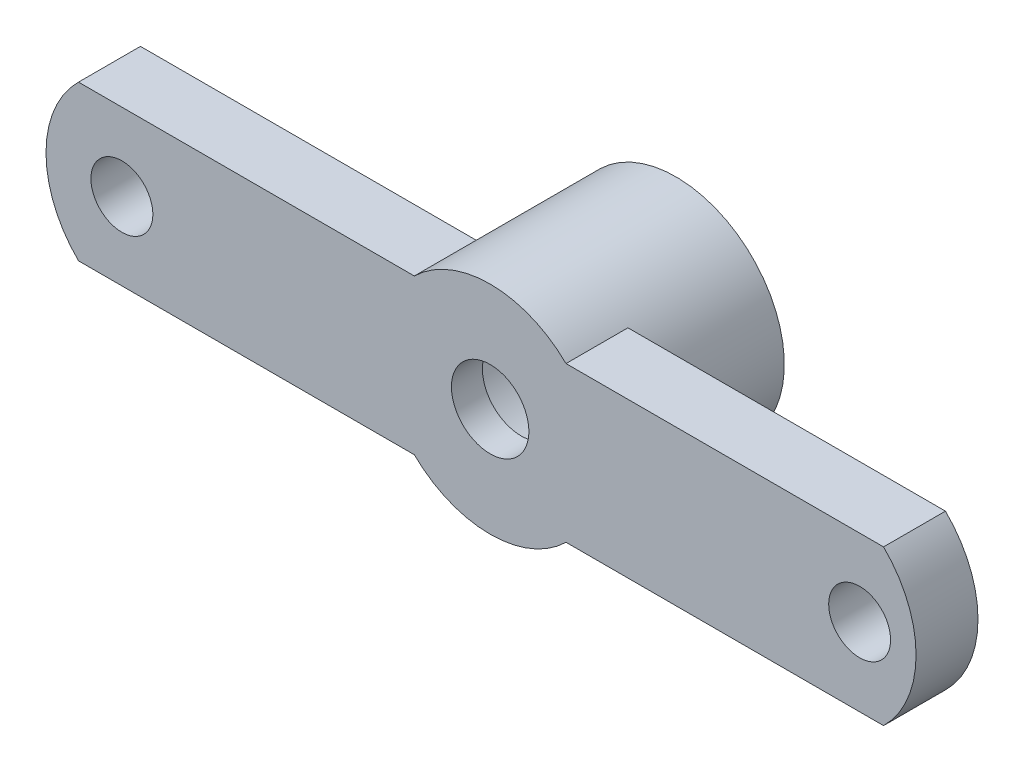
ISO-10303-21;
HEADER;
FILE_DESCRIPTION(('STEP AP214'),'2;1');
FILE_NAME('part.step','',(''),(''),'','','');
FILE_SCHEMA(('AUTOMOTIVE_DESIGN { 1 0 10303 214 1 1 1 1 }'));
ENDSEC;
DATA;
#1=APPLICATION_CONTEXT('core data for automotive mechanical design processes');
#2=APPLICATION_PROTOCOL_DEFINITION('international standard','automotive_design',2000,#1);
#3=PRODUCT_CONTEXT('',#1,'mechanical');
#4=PRODUCT('Part','Part','',(#3));
#5=PRODUCT_RELATED_PRODUCT_CATEGORY('part','',(#4));
#6=PRODUCT_DEFINITION_FORMATION('','',#4);
#7=PRODUCT_DEFINITION_CONTEXT('part definition',#1,'design');
#8=PRODUCT_DEFINITION('design','',#6,#7);
#9=PRODUCT_DEFINITION_SHAPE('','',#8);
#10=(LENGTH_UNIT() NAMED_UNIT(*) SI_UNIT(.MILLI.,.METRE.));
#11=(NAMED_UNIT(*) PLANE_ANGLE_UNIT() SI_UNIT($,.RADIAN.));
#12=(NAMED_UNIT(*) SI_UNIT($,.STERADIAN.) SOLID_ANGLE_UNIT());
#13=UNCERTAINTY_MEASURE_WITH_UNIT(LENGTH_MEASURE(1.E-05),#10,'distance_accuracy_value','');
#14=(GEOMETRIC_REPRESENTATION_CONTEXT(3) GLOBAL_UNCERTAINTY_ASSIGNED_CONTEXT((#13)) GLOBAL_UNIT_ASSIGNED_CONTEXT((#10,
#11,#12)) REPRESENTATION_CONTEXT('',''));
#15=CARTESIAN_POINT('',(0.,0.,0.));
#16=DIRECTION('',(0.,0.,1.));
#17=DIRECTION('',(1.,0.,0.));
#18=AXIS2_PLACEMENT_3D('',#15,#16,#17);
#19=CARTESIAN_POINT('',(-11.6223723187971,-8.25639590201215,2.));
#20=DIRECTION('',(0.,0.,-1.));
#21=DIRECTION('',(-1.,0.,0.));
#22=AXIS2_PLACEMENT_3D('',#19,#20,#21);
#23=CYLINDRICAL_SURFACE('',#22,3.5);
#24=DIRECTION('',(0.,0.,-1.));
#25=VECTOR('',#24,1.);
#26=CARTESIAN_POINT('',(-9.17288257601393,-10.7563959020122,2.));
#27=LINE('',#26,#25);
#28=CARTESIAN_POINT('',(-9.17288257601393,-10.7563959020122,2.));
#29=VERTEX_POINT('',#28);
#30=CARTESIAN_POINT('',(-9.17288257601394,-10.7563959020122,0.));
#31=VERTEX_POINT('',#30);
#32=EDGE_CURVE('E110',#29,#31,#27,.T.);
#33=ORIENTED_EDGE('',*,*,#32,.F.);
#34=CARTESIAN_POINT('',(-11.6223723187971,-8.25639590201215,2.));
#35=DIRECTION('',(0.,0.,-1.));
#36=DIRECTION('',(-1.,0.,0.));
#37=AXIS2_PLACEMENT_3D('',#34,#35,#36);
#38=CIRCLE('',#37,3.5);
#39=CARTESIAN_POINT('',(-14.0718620615803,-10.7563959020122,2.));
#40=VERTEX_POINT('',#39);
#41=EDGE_CURVE('E43',#29,#40,#38,.T.);
#42=ORIENTED_EDGE('',*,*,#41,.T.);
#43=DIRECTION('',(0.,0.,-1.));
#44=VECTOR('',#43,1.);
#45=CARTESIAN_POINT('',(-14.0718620615803,-10.7563959020122,2.));
#46=LINE('',#45,#44);
#47=CARTESIAN_POINT('',(-14.0718620615803,-10.7563959020122,0.));
#48=VERTEX_POINT('',#47);
#49=EDGE_CURVE('E133',#40,#48,#46,.T.);
#50=ORIENTED_EDGE('',*,*,#49,.T.);
#51=CARTESIAN_POINT('',(-11.6223723187971,-8.25639590201215,0.));
#52=DIRECTION('',(0.,0.,1.));
#53=DIRECTION('',(1.,0.,0.));
#54=AXIS2_PLACEMENT_3D('',#51,#52,#53);
#55=CIRCLE('',#54,3.5);
#56=CARTESIAN_POINT('',(-14.0718620615803,-5.75639590201217,0.));
#57=VERTEX_POINT('',#56);
#58=EDGE_CURVE('E136',#57,#48,#55,.T.);
#59=ORIENTED_EDGE('',*,*,#58,.F.);
#60=DIRECTION('',(0.,0.,-1.));
#61=VECTOR('',#60,1.);
#62=CARTESIAN_POINT('',(-14.0718620615803,-5.75639590201217,2.));
#63=LINE('',#62,#61);
#64=CARTESIAN_POINT('',(-14.0718620615803,-5.75639590201217,2.));
#65=VERTEX_POINT('',#64);
#66=EDGE_CURVE('E141',#65,#57,#63,.T.);
#67=ORIENTED_EDGE('',*,*,#66,.F.);
#68=CARTESIAN_POINT('',(-9.17288257601391,-5.75639590201216,2.));
#69=VERTEX_POINT('',#68);
#70=EDGE_CURVE('E11',#65,#69,#38,.T.);
#71=ORIENTED_EDGE('',*,*,#70,.T.);
#72=DIRECTION('',(0.,0.,-1.));
#73=VECTOR('',#72,1.);
#74=CARTESIAN_POINT('',(-9.17288257601392,-5.75639590201216,2.));
#75=LINE('',#74,#73);
#76=CARTESIAN_POINT('',(-9.17288257601392,-5.75639590201216,0.));
#77=VERTEX_POINT('',#76);
#78=EDGE_CURVE('E54',#69,#77,#75,.T.);
#79=ORIENTED_EDGE('',*,*,#78,.T.);
#80=CARTESIAN_POINT('',(-11.6223723187971,-8.25639590201215,0.));
#81=DIRECTION('',(0.,0.,1.));
#82=DIRECTION('',(1.,0.,0.));
#83=AXIS2_PLACEMENT_3D('',#80,#81,#82);
#84=CIRCLE('',#83,3.5);
#85=EDGE_CURVE('E50',#31,#77,#84,.T.);
#86=ORIENTED_EDGE('',*,*,#85,.F.);
#87=EDGE_LOOP('',(#33,#42,#50,#59,#67,#71,#79,#86));
#88=FACE_BOUND('',#87,.T.);
#89=CARTESIAN_POINT('',(-11.6223723187971,-8.25639590201215,-4.0000000000584));
#90=DIRECTION('',(0.,0.,-1.));
#91=DIRECTION('',(-1.,0.,0.));
#92=AXIS2_PLACEMENT_3D('',#89,#90,#91);
#93=CIRCLE('',#92,3.5);
#94=CARTESIAN_POINT('',(-15.1223723187971,-8.25639590201215,-4.0000000000584));
#95=VERTEX_POINT('',#94);
#96=EDGE_CURVE('E108',#95,#95,#93,.T.);
#97=ORIENTED_EDGE('',*,*,#96,.F.);
#98=EDGE_LOOP('',(#97));
#99=FACE_BOUND('',#98,.T.);
#100=ADVANCED_FACE('F36',(#88,#99),#23,.T.);
#101=CARTESIAN_POINT('',(-8.1223723187971,-8.25639590201215,2.));
#102=DIRECTION('',(0.,0.,1.));
#103=DIRECTION('',(1.,0.,0.));
#104=AXIS2_PLACEMENT_3D('',#101,#102,#103);
#105=PLANE('',#104);
#106=CARTESIAN_POINT('',(-11.6223723187971,-8.25639590201215,2.));
#107=DIRECTION('',(0.,0.,-1.));
#108=DIRECTION('',(-1.,0.,0.));
#109=AXIS2_PLACEMENT_3D('',#106,#107,#108);
#110=CIRCLE('',#109,1.25000000000001);
#111=CARTESIAN_POINT('',(-12.8723723187971,-8.25639590201215,2.));
#112=VERTEX_POINT('',#111);
#113=EDGE_CURVE('E240',#112,#112,#110,.T.);
#114=ORIENTED_EDGE('',*,*,#113,.T.);
#115=EDGE_LOOP('',(#114));
#116=FACE_BOUND('',#115,.T.);
#117=CARTESIAN_POINT('',(0.31035867178774,-8.24404590201214,2.));
#118=DIRECTION('',(0.,0.,-1.));
#119=DIRECTION('',(-1.,0.,0.));
#120=AXIS2_PLACEMENT_3D('',#117,#118,#119);
#121=CIRCLE('',#120,0.999999999999987);
#122=CARTESIAN_POINT('',(-0.689641328212247,-8.24404590201214,2.));
#123=VERTEX_POINT('',#122);
#124=EDGE_CURVE('E245',#123,#123,#121,.T.);
#125=ORIENTED_EDGE('',*,*,#124,.T.);
#126=EDGE_LOOP('',(#125));
#127=FACE_BOUND('',#126,.T.);
#128=CARTESIAN_POINT('',(-23.5173462051118,-8.25644590201214,2.));
#129=DIRECTION('',(0.,0.,-1.));
#130=DIRECTION('',(-1.,0.,0.));
#131=AXIS2_PLACEMENT_3D('',#128,#129,#130);
#132=CIRCLE('',#131,0.999999999999987);
#133=CARTESIAN_POINT('',(-24.5173462051118,-8.25644590201214,2.));
#134=VERTEX_POINT('',#133);
#135=EDGE_CURVE('E119',#134,#134,#132,.T.);
#136=ORIENTED_EDGE('',*,*,#135,.T.);
#137=EDGE_LOOP('',(#136));
#138=FACE_BOUND('',#137,.T.);
#139=ORIENTED_EDGE('',*,*,#70,.F.);
#140=DIRECTION('',(-1.,0.,0.));
#141=VECTOR('',#140,1.);
#142=CARTESIAN_POINT('',(-14.0718620615803,-5.75639590201217,2.));
#143=LINE('',#142,#141);
#144=CARTESIAN_POINT('',(-24.9170962051118,-5.75639590201216,2.));
#145=VERTEX_POINT('',#144);
#146=EDGE_CURVE('E150',#65,#145,#143,.T.);
#147=ORIENTED_EDGE('',*,*,#146,.T.);
#148=CARTESIAN_POINT('',(-22.4676064623286,-8.25639590201214,2.));
#149=DIRECTION('',(0.,0.,-1.));
#150=DIRECTION('',(-1.,0.,0.));
#151=AXIS2_PLACEMENT_3D('',#148,#149,#150);
#152=CIRCLE('',#151,3.5);
#153=CARTESIAN_POINT('',(-24.9170962051118,-10.7563959020122,2.));
#154=VERTEX_POINT('',#153);
#155=EDGE_CURVE('E151',#154,#145,#152,.T.);
#156=ORIENTED_EDGE('',*,*,#155,.F.);
#157=DIRECTION('',(-1.,0.,0.));
#158=VECTOR('',#157,1.);
#159=CARTESIAN_POINT('',(-14.0718620615803,-10.7563959020122,2.));
#160=LINE('',#159,#158);
#161=EDGE_CURVE('E106',#40,#154,#160,.T.);
#162=ORIENTED_EDGE('',*,*,#161,.F.);
#163=ORIENTED_EDGE('',*,*,#41,.F.);
#164=DIRECTION('',(1.,0.,0.));
#165=VECTOR('',#164,1.);
#166=CARTESIAN_POINT('',(-9.17288257601393,-10.7563959020122,2.));
#167=LINE('',#166,#165);
#168=CARTESIAN_POINT('',(1.08290379488819,-10.7563959020122,2.));
#169=VERTEX_POINT('',#168);
#170=EDGE_CURVE('E102',#29,#169,#167,.T.);
#171=ORIENTED_EDGE('',*,*,#170,.T.);
#172=CARTESIAN_POINT('',(-1.36658594789498,-8.25639590201215,2.));
#173=DIRECTION('',(0.,0.,-1.));
#174=DIRECTION('',(-1.,0.,0.));
#175=AXIS2_PLACEMENT_3D('',#172,#173,#174);
#176=CIRCLE('',#175,3.5);
#177=CARTESIAN_POINT('',(1.08290379488821,-5.75639590201216,2.));
#178=VERTEX_POINT('',#177);
#179=EDGE_CURVE('E127',#178,#169,#176,.T.);
#180=ORIENTED_EDGE('',*,*,#179,.F.);
#181=DIRECTION('',(1.,0.,0.));
#182=VECTOR('',#181,1.);
#183=CARTESIAN_POINT('',(-9.17288257601392,-5.75639590201216,2.));
#184=LINE('',#183,#182);
#185=EDGE_CURVE('E123',#69,#178,#184,.T.);
#186=ORIENTED_EDGE('',*,*,#185,.F.);
#187=EDGE_LOOP('',(#139,#147,#156,#162,#163,#171,#180,#186));
#188=FACE_BOUND('',#187,.T.);
#189=ADVANCED_FACE('F99',(#116,#127,#138,#188),#105,.T.);
#190=CARTESIAN_POINT('',(-11.6223723187971,-8.25639590201215,-4.0000000000584));
#191=DIRECTION('',(0.,0.,-1.));
#192=DIRECTION('',(-1.,0.,0.));
#193=AXIS2_PLACEMENT_3D('',#190,#191,#192);
#194=PLANE('',#193);
#195=CARTESIAN_POINT('',(-11.6223723187971,-8.25639590201215,-4.0000000000584));
#196=DIRECTION('',(0.,0.,-1.));
#197=DIRECTION('',(-1.,0.,0.));
#198=AXIS2_PLACEMENT_3D('',#195,#196,#197);
#199=CIRCLE('',#198,2.5);
#200=CARTESIAN_POINT('',(-14.1223723187971,-8.25639590201215,-4.0000000000584));
#201=VERTEX_POINT('',#200);
#202=EDGE_CURVE('E233',#201,#201,#199,.T.);
#203=ORIENTED_EDGE('',*,*,#202,.F.);
#204=EDGE_LOOP('',(#203));
#205=FACE_BOUND('',#204,.T.);
#206=ORIENTED_EDGE('',*,*,#96,.T.);
#207=EDGE_LOOP('',(#206));
#208=FACE_BOUND('',#207,.T.);
#209=ADVANCED_FACE('F162',(#205,#208),#194,.T.);
#210=CARTESIAN_POINT('',(-22.4676064623286,-8.25639590201214,2.));
#211=DIRECTION('',(0.,0.,-1.));
#212=DIRECTION('',(-1.,0.,0.));
#213=AXIS2_PLACEMENT_3D('',#210,#211,#212);
#214=CYLINDRICAL_SURFACE('',#213,3.5);
#215=DIRECTION('',(0.,0.,-1.));
#216=VECTOR('',#215,1.);
#217=CARTESIAN_POINT('',(-24.9170962051118,-10.7563959020122,2.));
#218=LINE('',#217,#216);
#219=CARTESIAN_POINT('',(-24.9170962051118,-10.7563959020122,0.));
#220=VERTEX_POINT('',#219);
#221=EDGE_CURVE('E135',#154,#220,#218,.T.);
#222=ORIENTED_EDGE('',*,*,#221,.F.);
#223=ORIENTED_EDGE('',*,*,#155,.T.);
#224=DIRECTION('',(0.,0.,-1.));
#225=VECTOR('',#224,1.);
#226=CARTESIAN_POINT('',(-24.9170962051118,-5.75639590201216,2.));
#227=LINE('',#226,#225);
#228=CARTESIAN_POINT('',(-24.9170962051118,-5.75639590201216,0.));
#229=VERTEX_POINT('',#228);
#230=EDGE_CURVE('E145',#145,#229,#227,.T.);
#231=ORIENTED_EDGE('',*,*,#230,.T.);
#232=CARTESIAN_POINT('',(-22.4676064623286,-8.25639590201214,0.));
#233=DIRECTION('',(0.,0.,1.));
#234=DIRECTION('',(1.,0.,0.));
#235=AXIS2_PLACEMENT_3D('',#232,#233,#234);
#236=CIRCLE('',#235,3.5);
#237=EDGE_CURVE('E140',#229,#220,#236,.T.);
#238=ORIENTED_EDGE('',*,*,#237,.T.);
#239=EDGE_LOOP('',(#222,#223,#231,#238));
#240=FACE_BOUND('',#239,.T.);
#241=ADVANCED_FACE('F171',(#240),#214,.T.);
#242=CARTESIAN_POINT('',(-14.0718620615803,-5.75639590201217,2.));
#243=DIRECTION('',(0.,1.,0.));
#244=DIRECTION('',(-1.,0.,0.));
#245=AXIS2_PLACEMENT_3D('',#242,#243,#244);
#246=PLANE('',#245);
#247=ORIENTED_EDGE('',*,*,#230,.F.);
#248=ORIENTED_EDGE('',*,*,#146,.F.);
#249=ORIENTED_EDGE('',*,*,#66,.T.);
#250=DIRECTION('',(-1.,0.,0.));
#251=VECTOR('',#250,1.);
#252=CARTESIAN_POINT('',(-14.0718620615803,-5.75639590201217,0.));
#253=LINE('',#252,#251);
#254=EDGE_CURVE('E144',#57,#229,#253,.T.);
#255=ORIENTED_EDGE('',*,*,#254,.T.);
#256=EDGE_LOOP('',(#247,#248,#249,#255));
#257=FACE_BOUND('',#256,.T.);
#258=ADVANCED_FACE('F180',(#257),#246,.T.);
#259=CARTESIAN_POINT('',(-14.0718620615803,-10.7563959020122,0.));
#260=DIRECTION('',(0.,0.,-1.));
#261=DIRECTION('',(-1.,0.,0.));
#262=AXIS2_PLACEMENT_3D('',#259,#260,#261);
#263=PLANE('',#262);
#264=CARTESIAN_POINT('',(-23.5173462051118,-8.25644590201214,0.));
#265=DIRECTION('',(0.,0.,-1.));
#266=DIRECTION('',(-1.,0.,0.));
#267=AXIS2_PLACEMENT_3D('',#264,#265,#266);
#268=CIRCLE('',#267,0.999999999999987);
#269=CARTESIAN_POINT('',(-24.5173462051118,-8.25644590201214,0.));
#270=VERTEX_POINT('',#269);
#271=EDGE_CURVE('E248',#270,#270,#268,.T.);
#272=ORIENTED_EDGE('',*,*,#271,.F.);
#273=EDGE_LOOP('',(#272));
#274=FACE_BOUND('',#273,.T.);
#275=ORIENTED_EDGE('',*,*,#237,.F.);
#276=ORIENTED_EDGE('',*,*,#254,.F.);
#277=ORIENTED_EDGE('',*,*,#58,.T.);
#278=DIRECTION('',(-1.,0.,0.));
#279=VECTOR('',#278,1.);
#280=CARTESIAN_POINT('',(-14.0718620615803,-10.7563959020122,0.));
#281=LINE('',#280,#279);
#282=EDGE_CURVE('E139',#48,#220,#281,.T.);
#283=ORIENTED_EDGE('',*,*,#282,.T.);
#284=EDGE_LOOP('',(#275,#276,#277,#283));
#285=FACE_BOUND('',#284,.T.);
#286=ADVANCED_FACE('F186',(#274,#285),#263,.T.);
#287=CARTESIAN_POINT('',(-14.0718620615803,-10.7563959020122,2.));
#288=DIRECTION('',(0.,1.,0.));
#289=DIRECTION('',(-1.,0.,0.));
#290=AXIS2_PLACEMENT_3D('',#287,#288,#289);
#291=PLANE('',#290);
#292=ORIENTED_EDGE('',*,*,#221,.T.);
#293=ORIENTED_EDGE('',*,*,#282,.F.);
#294=ORIENTED_EDGE('',*,*,#49,.F.);
#295=ORIENTED_EDGE('',*,*,#161,.T.);
#296=EDGE_LOOP('',(#292,#293,#294,#295));
#297=FACE_BOUND('',#296,.T.);
#298=ADVANCED_FACE('F174',(#297),#291,.F.);
#299=CARTESIAN_POINT('',(-1.36658594789498,-8.25639590201215,2.));
#300=DIRECTION('',(0.,0.,-1.));
#301=DIRECTION('',(-1.,0.,0.));
#302=AXIS2_PLACEMENT_3D('',#299,#300,#301);
#303=CYLINDRICAL_SURFACE('',#302,3.5);
#304=DIRECTION('',(0.,0.,-1.));
#305=VECTOR('',#304,1.);
#306=CARTESIAN_POINT('',(1.08290379488819,-10.7563959020122,2.));
#307=LINE('',#306,#305);
#308=CARTESIAN_POINT('',(1.08290379488819,-10.7563959020122,0.));
#309=VERTEX_POINT('',#308);
#310=EDGE_CURVE('E117',#169,#309,#307,.T.);
#311=ORIENTED_EDGE('',*,*,#310,.T.);
#312=CARTESIAN_POINT('',(-1.36658594789498,-8.25639590201215,0.));
#313=DIRECTION('',(0.,0.,1.));
#314=DIRECTION('',(1.,0.,0.));
#315=AXIS2_PLACEMENT_3D('',#312,#313,#314);
#316=CIRCLE('',#315,3.5);
#317=CARTESIAN_POINT('',(1.08290379488821,-5.75639590201216,0.));
#318=VERTEX_POINT('',#317);
#319=EDGE_CURVE('E131',#309,#318,#316,.T.);
#320=ORIENTED_EDGE('',*,*,#319,.T.);
#321=DIRECTION('',(0.,0.,-1.));
#322=VECTOR('',#321,1.);
#323=CARTESIAN_POINT('',(1.08290379488821,-5.75639590201216,2.));
#324=LINE('',#323,#322);
#325=EDGE_CURVE('E126',#178,#318,#324,.T.);
#326=ORIENTED_EDGE('',*,*,#325,.F.);
#327=ORIENTED_EDGE('',*,*,#179,.T.);
#328=EDGE_LOOP('',(#311,#320,#326,#327));
#329=FACE_BOUND('',#328,.T.);
#330=ADVANCED_FACE('F185',(#329),#303,.T.);
#331=CARTESIAN_POINT('',(-9.17288257601393,-10.7563959020122,2.));
#332=DIRECTION('',(0.,-1.,0.));
#333=DIRECTION('',(0.,0.,-1.));
#334=AXIS2_PLACEMENT_3D('',#331,#332,#333);
#335=PLANE('',#334);
#336=ORIENTED_EDGE('',*,*,#310,.F.);
#337=ORIENTED_EDGE('',*,*,#170,.F.);
#338=ORIENTED_EDGE('',*,*,#32,.T.);
#339=DIRECTION('',(1.,0.,0.));
#340=VECTOR('',#339,1.);
#341=CARTESIAN_POINT('',(-9.17288257601394,-10.7563959020122,0.));
#342=LINE('',#341,#340);
#343=EDGE_CURVE('E114',#31,#309,#342,.T.);
#344=ORIENTED_EDGE('',*,*,#343,.T.);
#345=EDGE_LOOP('',(#336,#337,#338,#344));
#346=FACE_BOUND('',#345,.T.);
#347=ADVANCED_FACE('F116',(#346),#335,.T.);
#348=CARTESIAN_POINT('',(-9.17288257601391,-5.75639590201216,0.));
#349=DIRECTION('',(0.,0.,-1.));
#350=DIRECTION('',(-1.,0.,0.));
#351=AXIS2_PLACEMENT_3D('',#348,#349,#350);
#352=PLANE('',#351);
#353=CARTESIAN_POINT('',(0.31035867178774,-8.24404590201214,0.));
#354=DIRECTION('',(0.,0.,-1.));
#355=DIRECTION('',(-1.,0.,0.));
#356=AXIS2_PLACEMENT_3D('',#353,#354,#355);
#357=CIRCLE('',#356,0.999999999999987);
#358=CARTESIAN_POINT('',(-0.689641328212247,-8.24404590201214,0.));
#359=VERTEX_POINT('',#358);
#360=EDGE_CURVE('E242',#359,#359,#357,.T.);
#361=ORIENTED_EDGE('',*,*,#360,.F.);
#362=EDGE_LOOP('',(#361));
#363=FACE_BOUND('',#362,.T.);
#364=ORIENTED_EDGE('',*,*,#319,.F.);
#365=ORIENTED_EDGE('',*,*,#343,.F.);
#366=ORIENTED_EDGE('',*,*,#85,.T.);
#367=DIRECTION('',(1.,0.,0.));
#368=VECTOR('',#367,1.);
#369=CARTESIAN_POINT('',(-9.17288257601391,-5.75639590201216,0.));
#370=LINE('',#369,#368);
#371=EDGE_CURVE('E128',#77,#318,#370,.T.);
#372=ORIENTED_EDGE('',*,*,#371,.T.);
#373=EDGE_LOOP('',(#364,#365,#366,#372));
#374=FACE_BOUND('',#373,.T.);
#375=ADVANCED_FACE('F198',(#363,#374),#352,.T.);
#376=CARTESIAN_POINT('',(-9.17288257601392,-5.75639590201216,2.));
#377=DIRECTION('',(0.,-1.,0.));
#378=DIRECTION('',(0.,0.,-1.));
#379=AXIS2_PLACEMENT_3D('',#376,#377,#378);
#380=PLANE('',#379);
#381=ORIENTED_EDGE('',*,*,#325,.T.);
#382=ORIENTED_EDGE('',*,*,#371,.F.);
#383=ORIENTED_EDGE('',*,*,#78,.F.);
#384=ORIENTED_EDGE('',*,*,#185,.T.);
#385=EDGE_LOOP('',(#381,#382,#383,#384));
#386=FACE_BOUND('',#385,.T.);
#387=ADVANCED_FACE('F182',(#386),#380,.F.);
#388=CARTESIAN_POINT('',(-23.5173462051118,-8.25644590201214,0.));
#389=DIRECTION('',(0.,0.,-1.));
#390=DIRECTION('',(-1.,0.,0.));
#391=AXIS2_PLACEMENT_3D('',#388,#389,#390);
#392=CYLINDRICAL_SURFACE('',#391,0.999999999999987);
#393=ORIENTED_EDGE('',*,*,#135,.F.);
#394=EDGE_LOOP('',(#393));
#395=FACE_BOUND('',#394,.T.);
#396=ORIENTED_EDGE('',*,*,#271,.T.);
#397=EDGE_LOOP('',(#396));
#398=FACE_BOUND('',#397,.T.);
#399=ADVANCED_FACE('F197',(#395,#398),#392,.F.);
#400=CARTESIAN_POINT('',(0.31035867178774,-8.24404590201214,0.));
#401=DIRECTION('',(0.,0.,-1.));
#402=DIRECTION('',(-1.,0.,0.));
#403=AXIS2_PLACEMENT_3D('',#400,#401,#402);
#404=CYLINDRICAL_SURFACE('',#403,0.999999999999987);
#405=ORIENTED_EDGE('',*,*,#124,.F.);
#406=EDGE_LOOP('',(#405));
#407=FACE_BOUND('',#406,.T.);
#408=ORIENTED_EDGE('',*,*,#360,.T.);
#409=EDGE_LOOP('',(#408));
#410=FACE_BOUND('',#409,.T.);
#411=ADVANCED_FACE('F209',(#407,#410),#404,.F.);
#412=CARTESIAN_POINT('',(-11.6223723187971,-8.25639590201215,-4.0000000000584));
#413=DIRECTION('',(0.,0.,-1.));
#414=DIRECTION('',(-1.,0.,0.));
#415=AXIS2_PLACEMENT_3D('',#412,#413,#414);
#416=CYLINDRICAL_SURFACE('',#415,1.25000000000001);
#417=ORIENTED_EDGE('',*,*,#113,.F.);
#418=EDGE_LOOP('',(#417));
#419=FACE_BOUND('',#418,.T.);
#420=CARTESIAN_POINT('',(-11.6223723187971,-8.25639590201215,0.999999999941596));
#421=DIRECTION('',(0.,0.,-1.));
#422=DIRECTION('',(-1.,0.,0.));
#423=AXIS2_PLACEMENT_3D('',#420,#421,#422);
#424=CIRCLE('',#423,1.25000000000001);
#425=CARTESIAN_POINT('',(-12.8723723187971,-8.25639590201215,0.999999999941596));
#426=VERTEX_POINT('',#425);
#427=EDGE_CURVE('E235',#426,#426,#424,.T.);
#428=ORIENTED_EDGE('',*,*,#427,.T.);
#429=EDGE_LOOP('',(#428));
#430=FACE_BOUND('',#429,.T.);
#431=ADVANCED_FACE('F213',(#419,#430),#416,.F.);
#432=CARTESIAN_POINT('',(-10.3723723187971,-8.25639590201215,0.999999999941596));
#433=DIRECTION('',(0.,0.,1.));
#434=DIRECTION('',(1.,0.,0.));
#435=AXIS2_PLACEMENT_3D('',#432,#433,#434);
#436=PLANE('',#435);
#437=ORIENTED_EDGE('',*,*,#427,.F.);
#438=EDGE_LOOP('',(#437));
#439=FACE_BOUND('',#438,.T.);
#440=CARTESIAN_POINT('',(-11.6223723187971,-8.25639590201215,0.999999999941596));
#441=DIRECTION('',(0.,0.,-1.));
#442=DIRECTION('',(-1.,0.,0.));
#443=AXIS2_PLACEMENT_3D('',#440,#441,#442);
#444=CIRCLE('',#443,2.5);
#445=CARTESIAN_POINT('',(-14.1223723187971,-8.25639590201215,0.999999999941596));
#446=VERTEX_POINT('',#445);
#447=EDGE_CURVE('E230',#446,#446,#444,.T.);
#448=ORIENTED_EDGE('',*,*,#447,.T.);
#449=EDGE_LOOP('',(#448));
#450=FACE_BOUND('',#449,.T.);
#451=ADVANCED_FACE('F217',(#439,#450),#436,.F.);
#452=CARTESIAN_POINT('',(-11.6223723187971,-8.25639590201215,-4.0000000000584));
#453=DIRECTION('',(0.,0.,-1.));
#454=DIRECTION('',(-1.,0.,0.));
#455=AXIS2_PLACEMENT_3D('',#452,#453,#454);
#456=CYLINDRICAL_SURFACE('',#455,2.5);
#457=ORIENTED_EDGE('',*,*,#447,.F.);
#458=EDGE_LOOP('',(#457));
#459=FACE_BOUND('',#458,.T.);
#460=ORIENTED_EDGE('',*,*,#202,.T.);
#461=EDGE_LOOP('',(#460));
#462=FACE_BOUND('',#461,.T.);
#463=ADVANCED_FACE('F221',(#459,#462),#456,.F.);
#464=CLOSED_SHELL('',(#100,#189,#209,#241,#258,#286,#298,#330,#347,#375,#387,#399,#411,#431,
#451,#463));
#465=MANIFOLD_SOLID_BREP('B2',#464);
#466=ADVANCED_BREP_SHAPE_REPRESENTATION('',(#18,#465),#14);
#467=SHAPE_DEFINITION_REPRESENTATION(#9,#466);
ENDSEC;
END-ISO-10303-21;
